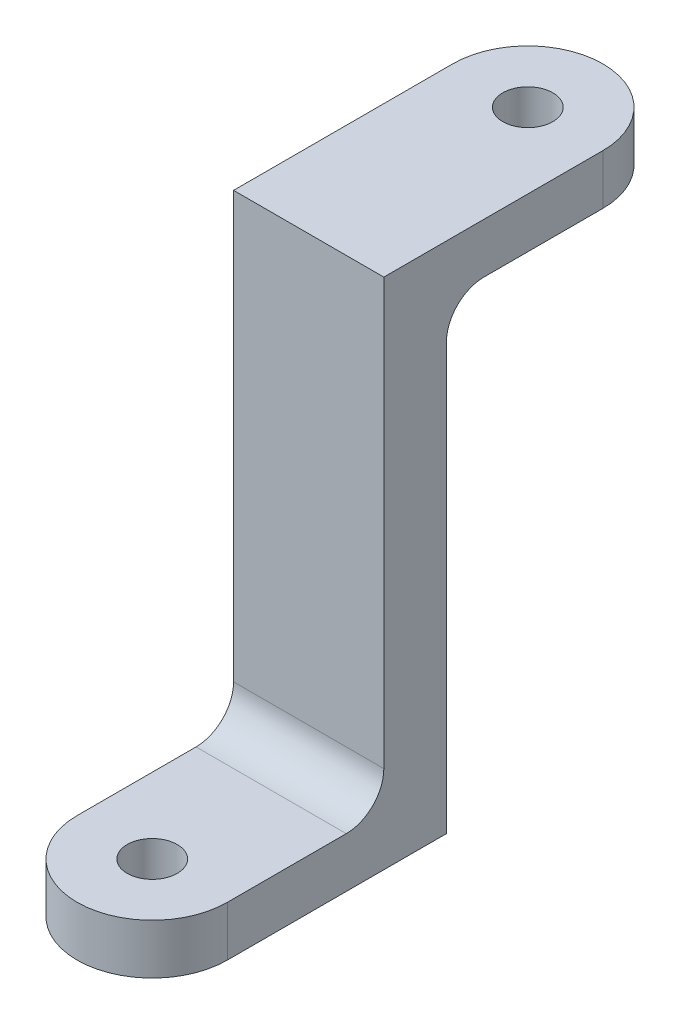
ISO-10303-21;
HEADER;
FILE_DESCRIPTION(('STEP AP214'),'2;1');
FILE_NAME('part.step','',(''),(''),'','','');
FILE_SCHEMA(('AUTOMOTIVE_DESIGN { 1 0 10303 214 1 1 1 1 }'));
ENDSEC;
DATA;
#1=APPLICATION_CONTEXT('core data for automotive mechanical design processes');
#2=APPLICATION_PROTOCOL_DEFINITION('international standard','automotive_design',2000,#1);
#3=PRODUCT_CONTEXT('',#1,'mechanical');
#4=PRODUCT('Part','Part','',(#3));
#5=PRODUCT_RELATED_PRODUCT_CATEGORY('part','',(#4));
#6=PRODUCT_DEFINITION_FORMATION('','',#4);
#7=PRODUCT_DEFINITION_CONTEXT('part definition',#1,'design');
#8=PRODUCT_DEFINITION('design','',#6,#7);
#9=PRODUCT_DEFINITION_SHAPE('','',#8);
#10=(LENGTH_UNIT() NAMED_UNIT(*) SI_UNIT(.MILLI.,.METRE.));
#11=(NAMED_UNIT(*) PLANE_ANGLE_UNIT() SI_UNIT($,.RADIAN.));
#12=(NAMED_UNIT(*) SI_UNIT($,.STERADIAN.) SOLID_ANGLE_UNIT());
#13=UNCERTAINTY_MEASURE_WITH_UNIT(LENGTH_MEASURE(1.E-05),#10,'distance_accuracy_value','');
#14=(GEOMETRIC_REPRESENTATION_CONTEXT(3) GLOBAL_UNCERTAINTY_ASSIGNED_CONTEXT((#13)) GLOBAL_UNIT_ASSIGNED_CONTEXT((#10,
#11,#12)) REPRESENTATION_CONTEXT('',''));
#15=CARTESIAN_POINT('',(0.,0.,0.));
#16=DIRECTION('',(0.,0.,1.));
#17=DIRECTION('',(1.,0.,0.));
#18=AXIS2_PLACEMENT_3D('',#15,#16,#17);
#19=CARTESIAN_POINT('',(6.,4.,0.));
#20=DIRECTION('',(1.,0.,0.));
#21=DIRECTION('',(0.,0.,-1.));
#22=AXIS2_PLACEMENT_3D('',#19,#20,#21);
#23=PLANE('',#22);
#24=DIRECTION('',(0.,0.,1.));
#25=VECTOR('',#24,1.);
#26=CARTESIAN_POINT('',(6.,0.,0.));
#27=LINE('',#26,#25);
#28=CARTESIAN_POINT('',(6.,0.,-17.5));
#29=VERTEX_POINT('',#28);
#30=CARTESIAN_POINT('',(6.,0.,0.));
#31=VERTEX_POINT('',#30);
#32=EDGE_CURVE('E134',#29,#31,#27,.T.);
#33=ORIENTED_EDGE('',*,*,#32,.F.);
#34=DIRECTION('',(0.,-1.,0.));
#35=VECTOR('',#34,1.);
#36=CARTESIAN_POINT('',(6.,37.,-17.5));
#37=LINE('',#36,#35);
#38=CARTESIAN_POINT('',(6.,34.,-17.5));
#39=VERTEX_POINT('',#38);
#40=EDGE_CURVE('E119',#39,#29,#37,.T.);
#41=ORIENTED_EDGE('',*,*,#40,.F.);
#42=CARTESIAN_POINT('',(6.,34.,-20.5));
#43=DIRECTION('',(1.,0.,0.));
#44=DIRECTION('',(0.,0.,-1.));
#45=AXIS2_PLACEMENT_3D('',#42,#43,#44);
#46=CIRCLE('',#45,3.);
#47=CARTESIAN_POINT('',(6.,37.,-20.5));
#48=VERTEX_POINT('',#47);
#49=EDGE_CURVE('E161',#39,#48,#46,.F.);
#50=ORIENTED_EDGE('',*,*,#49,.T.);
#51=DIRECTION('',(0.,0.,-1.));
#52=VECTOR('',#51,1.);
#53=CARTESIAN_POINT('',(6.,37.,0.));
#54=LINE('',#53,#52);
#55=CARTESIAN_POINT('',(6.,37.,-30.));
#56=VERTEX_POINT('',#55);
#57=EDGE_CURVE('E166',#48,#56,#54,.T.);
#58=ORIENTED_EDGE('',*,*,#57,.T.);
#59=DIRECTION('',(0.,-1.,0.));
#60=VECTOR('',#59,1.);
#61=CARTESIAN_POINT('',(6.,41.,-30.));
#62=LINE('',#61,#60);
#63=CARTESIAN_POINT('',(6.,41.,-30.));
#64=VERTEX_POINT('',#63);
#65=EDGE_CURVE('E240',#64,#56,#62,.T.);
#66=ORIENTED_EDGE('',*,*,#65,.F.);
#67=DIRECTION('',(0.,0.,-1.));
#68=VECTOR('',#67,1.);
#69=CARTESIAN_POINT('',(6.,41.,0.));
#70=LINE('',#69,#68);
#71=CARTESIAN_POINT('',(6.,41.,-12.5));
#72=VERTEX_POINT('',#71);
#73=EDGE_CURVE('E261',#72,#64,#70,.T.);
#74=ORIENTED_EDGE('',*,*,#73,.F.);
#75=DIRECTION('',(0.,-1.,0.));
#76=VECTOR('',#75,1.);
#77=CARTESIAN_POINT('',(6.,37.,-12.5));
#78=LINE('',#77,#76);
#79=CARTESIAN_POINT('',(6.,7.,-12.5));
#80=VERTEX_POINT('',#79);
#81=EDGE_CURVE('E138',#72,#80,#78,.T.);
#82=ORIENTED_EDGE('',*,*,#81,.T.);
#83=CARTESIAN_POINT('',(6.,7.,-9.5));
#84=DIRECTION('',(1.,0.,0.));
#85=DIRECTION('',(0.,0.,-1.));
#86=AXIS2_PLACEMENT_3D('',#83,#84,#85);
#87=CIRCLE('',#86,3.);
#88=CARTESIAN_POINT('',(6.,4.,-9.5));
#89=VERTEX_POINT('',#88);
#90=EDGE_CURVE('E11',#80,#89,#87,.F.);
#91=ORIENTED_EDGE('',*,*,#90,.T.);
#92=DIRECTION('',(0.,0.,1.));
#93=VECTOR('',#92,1.);
#94=CARTESIAN_POINT('',(6.,4.,0.));
#95=LINE('',#94,#93);
#96=CARTESIAN_POINT('',(6.,4.,0.));
#97=VERTEX_POINT('',#96);
#98=EDGE_CURVE('E144',#89,#97,#95,.T.);
#99=ORIENTED_EDGE('',*,*,#98,.T.);
#100=DIRECTION('',(0.,-1.,0.));
#101=VECTOR('',#100,1.);
#102=CARTESIAN_POINT('',(6.,4.,0.));
#103=LINE('',#102,#101);
#104=EDGE_CURVE('E145',#97,#31,#103,.T.);
#105=ORIENTED_EDGE('',*,*,#104,.T.);
#106=EDGE_LOOP('',(#33,#41,#50,#58,#66,#74,#82,#91,#99,#105));
#107=FACE_BOUND('',#106,.T.);
#108=ADVANCED_FACE('F35',(#107),#23,.T.);
#109=CARTESIAN_POINT('',(-6.,4.,0.));
#110=DIRECTION('',(1.,0.,0.));
#111=DIRECTION('',(0.,0.,-1.));
#112=AXIS2_PLACEMENT_3D('',#109,#110,#111);
#113=PLANE('',#112);
#114=DIRECTION('',(0.,-1.,0.));
#115=VECTOR('',#114,1.);
#116=CARTESIAN_POINT('',(-6.,37.,-17.5));
#117=LINE('',#116,#115);
#118=CARTESIAN_POINT('',(-6.,34.,-17.5));
#119=VERTEX_POINT('',#118);
#120=CARTESIAN_POINT('',(-6.,0.,-17.5));
#121=VERTEX_POINT('',#120);
#122=EDGE_CURVE('E108',#119,#121,#117,.T.);
#123=ORIENTED_EDGE('',*,*,#122,.T.);
#124=DIRECTION('',(0.,0.,1.));
#125=VECTOR('',#124,1.);
#126=CARTESIAN_POINT('',(-6.,0.,0.));
#127=LINE('',#126,#125);
#128=CARTESIAN_POINT('',(-6.,0.,0.));
#129=VERTEX_POINT('',#128);
#130=EDGE_CURVE('E113',#121,#129,#127,.T.);
#131=ORIENTED_EDGE('',*,*,#130,.T.);
#132=DIRECTION('',(0.,-1.,0.));
#133=VECTOR('',#132,1.);
#134=CARTESIAN_POINT('',(-6.,4.,0.));
#135=LINE('',#134,#133);
#136=CARTESIAN_POINT('',(-6.,4.,0.));
#137=VERTEX_POINT('',#136);
#138=EDGE_CURVE('E148',#137,#129,#135,.T.);
#139=ORIENTED_EDGE('',*,*,#138,.F.);
#140=DIRECTION('',(0.,0.,1.));
#141=VECTOR('',#140,1.);
#142=CARTESIAN_POINT('',(-6.,4.,0.));
#143=LINE('',#142,#141);
#144=CARTESIAN_POINT('',(-6.,4.,-9.5));
#145=VERTEX_POINT('',#144);
#146=EDGE_CURVE('E246',#145,#137,#143,.T.);
#147=ORIENTED_EDGE('',*,*,#146,.F.);
#148=CARTESIAN_POINT('',(-6.,7.,-9.5));
#149=DIRECTION('',(1.,0.,0.));
#150=DIRECTION('',(0.,0.,-1.));
#151=AXIS2_PLACEMENT_3D('',#148,#149,#150);
#152=CIRCLE('',#151,3.);
#153=CARTESIAN_POINT('',(-6.,7.,-12.5));
#154=VERTEX_POINT('',#153);
#155=EDGE_CURVE('E43',#145,#154,#152,.T.);
#156=ORIENTED_EDGE('',*,*,#155,.T.);
#157=DIRECTION('',(0.,-1.,0.));
#158=VECTOR('',#157,1.);
#159=CARTESIAN_POINT('',(-6.,37.,-12.5));
#160=LINE('',#159,#158);
#161=CARTESIAN_POINT('',(-6.,41.,-12.5));
#162=VERTEX_POINT('',#161);
#163=EDGE_CURVE('E120',#162,#154,#160,.T.);
#164=ORIENTED_EDGE('',*,*,#163,.F.);
#165=DIRECTION('',(0.,0.,1.));
#166=VECTOR('',#165,1.);
#167=CARTESIAN_POINT('',(-6.,41.,0.));
#168=LINE('',#167,#166);
#169=CARTESIAN_POINT('',(-6.,41.,-30.));
#170=VERTEX_POINT('',#169);
#171=EDGE_CURVE('E267',#170,#162,#168,.T.);
#172=ORIENTED_EDGE('',*,*,#171,.F.);
#173=DIRECTION('',(0.,-1.,0.));
#174=VECTOR('',#173,1.);
#175=CARTESIAN_POINT('',(-6.,41.,-30.));
#176=LINE('',#175,#174);
#177=CARTESIAN_POINT('',(-6.,37.,-30.));
#178=VERTEX_POINT('',#177);
#179=EDGE_CURVE('E237',#170,#178,#176,.T.);
#180=ORIENTED_EDGE('',*,*,#179,.T.);
#181=DIRECTION('',(0.,0.,1.));
#182=VECTOR('',#181,1.);
#183=CARTESIAN_POINT('',(-6.,37.,0.));
#184=LINE('',#183,#182);
#185=CARTESIAN_POINT('',(-6.,37.,-20.5));
#186=VERTEX_POINT('',#185);
#187=EDGE_CURVE('E234',#178,#186,#184,.T.);
#188=ORIENTED_EDGE('',*,*,#187,.T.);
#189=CARTESIAN_POINT('',(-6.,34.,-20.5));
#190=DIRECTION('',(1.,0.,0.));
#191=DIRECTION('',(0.,0.,-1.));
#192=AXIS2_PLACEMENT_3D('',#189,#190,#191);
#193=CIRCLE('',#192,3.);
#194=EDGE_CURVE('E116',#186,#119,#193,.T.);
#195=ORIENTED_EDGE('',*,*,#194,.T.);
#196=EDGE_LOOP('',(#123,#131,#139,#147,#156,#164,#172,#180,#188,#195));
#197=FACE_BOUND('',#196,.T.);
#198=ADVANCED_FACE('F110',(#197),#113,.F.);
#199=CARTESIAN_POINT('',(0.,0.,0.));
#200=DIRECTION('',(0.,1.,0.));
#201=DIRECTION('',(0.,0.,1.));
#202=AXIS2_PLACEMENT_3D('',#199,#200,#201);
#203=PLANE('',#202);
#204=CARTESIAN_POINT('',(0.,0.,0.));
#205=DIRECTION('',(0.,1.,0.));
#206=DIRECTION('',(0.,0.,1.));
#207=AXIS2_PLACEMENT_3D('',#204,#205,#206);
#208=CIRCLE('',#207,2.);
#209=CARTESIAN_POINT('',(0.,0.,2.));
#210=VERTEX_POINT('',#209);
#211=EDGE_CURVE('E136',#210,#210,#208,.T.);
#212=ORIENTED_EDGE('',*,*,#211,.T.);
#213=EDGE_LOOP('',(#212));
#214=FACE_BOUND('',#213,.T.);
#215=DIRECTION('',(-1.,0.,0.));
#216=VECTOR('',#215,1.);
#217=CARTESIAN_POINT('',(-6.,0.,-17.5));
#218=LINE('',#217,#216);
#219=EDGE_CURVE('E123',#29,#121,#218,.T.);
#220=ORIENTED_EDGE('',*,*,#219,.F.);
#221=ORIENTED_EDGE('',*,*,#32,.T.);
#222=CARTESIAN_POINT('',(0.,0.,0.));
#223=DIRECTION('',(0.,1.,0.));
#224=DIRECTION('',(0.,0.,1.));
#225=AXIS2_PLACEMENT_3D('',#222,#223,#224);
#226=CIRCLE('',#225,6.);
#227=EDGE_CURVE('E133',#129,#31,#226,.T.);
#228=ORIENTED_EDGE('',*,*,#227,.F.);
#229=ORIENTED_EDGE('',*,*,#130,.F.);
#230=EDGE_LOOP('',(#220,#221,#228,#229));
#231=FACE_BOUND('',#230,.T.);
#232=ADVANCED_FACE('F131',(#214,#231),#203,.F.);
#233=CARTESIAN_POINT('',(0.,4.,0.));
#234=DIRECTION('',(0.,1.,0.));
#235=DIRECTION('',(0.,0.,1.));
#236=AXIS2_PLACEMENT_3D('',#233,#234,#235);
#237=PLANE('',#236);
#238=CARTESIAN_POINT('',(0.,4.,0.));
#239=DIRECTION('',(0.,1.,0.));
#240=DIRECTION('',(0.,0.,1.));
#241=AXIS2_PLACEMENT_3D('',#238,#239,#240);
#242=CIRCLE('',#241,2.);
#243=CARTESIAN_POINT('',(0.,4.,2.));
#244=VERTEX_POINT('',#243);
#245=EDGE_CURVE('E149',#244,#244,#242,.T.);
#246=ORIENTED_EDGE('',*,*,#245,.F.);
#247=EDGE_LOOP('',(#246));
#248=FACE_BOUND('',#247,.T.);
#249=ORIENTED_EDGE('',*,*,#98,.F.);
#250=DIRECTION('',(-1.,0.,0.));
#251=VECTOR('',#250,1.);
#252=CARTESIAN_POINT('',(-6.,4.,-9.5));
#253=LINE('',#252,#251);
#254=EDGE_CURVE('E156',#89,#145,#253,.T.);
#255=ORIENTED_EDGE('',*,*,#254,.T.);
#256=ORIENTED_EDGE('',*,*,#146,.T.);
#257=CARTESIAN_POINT('',(0.,4.,0.));
#258=DIRECTION('',(0.,1.,0.));
#259=DIRECTION('',(0.,0.,1.));
#260=AXIS2_PLACEMENT_3D('',#257,#258,#259);
#261=CIRCLE('',#260,6.);
#262=EDGE_CURVE('E248',#137,#97,#261,.T.);
#263=ORIENTED_EDGE('',*,*,#262,.T.);
#264=EDGE_LOOP('',(#249,#255,#256,#263));
#265=FACE_BOUND('',#264,.T.);
#266=ADVANCED_FACE('F202',(#248,#265),#237,.T.);
#267=CARTESIAN_POINT('',(0.,4.,0.));
#268=DIRECTION('',(0.,-1.,0.));
#269=DIRECTION('',(0.,0.,-1.));
#270=AXIS2_PLACEMENT_3D('',#267,#268,#269);
#271=CYLINDRICAL_SURFACE('',#270,2.);
#272=ORIENTED_EDGE('',*,*,#245,.T.);
#273=EDGE_LOOP('',(#272));
#274=FACE_BOUND('',#273,.T.);
#275=ORIENTED_EDGE('',*,*,#211,.F.);
#276=EDGE_LOOP('',(#275));
#277=FACE_BOUND('',#276,.T.);
#278=ADVANCED_FACE('F198',(#274,#277),#271,.F.);
#279=CARTESIAN_POINT('',(0.,4.,0.));
#280=DIRECTION('',(0.,-1.,0.));
#281=DIRECTION('',(0.,0.,-1.));
#282=AXIS2_PLACEMENT_3D('',#279,#280,#281);
#283=CYLINDRICAL_SURFACE('',#282,6.);
#284=ORIENTED_EDGE('',*,*,#227,.T.);
#285=ORIENTED_EDGE('',*,*,#104,.F.);
#286=ORIENTED_EDGE('',*,*,#262,.F.);
#287=ORIENTED_EDGE('',*,*,#138,.T.);
#288=EDGE_LOOP('',(#284,#285,#286,#287));
#289=FACE_BOUND('',#288,.T.);
#290=ADVANCED_FACE('F194',(#289),#283,.T.);
#291=CARTESIAN_POINT('',(6.,37.,-12.5));
#292=DIRECTION('',(0.,0.,1.));
#293=DIRECTION('',(1.,0.,0.));
#294=AXIS2_PLACEMENT_3D('',#291,#292,#293);
#295=PLANE('',#294);
#296=ORIENTED_EDGE('',*,*,#163,.T.);
#297=DIRECTION('',(-1.,0.,0.));
#298=VECTOR('',#297,1.);
#299=CARTESIAN_POINT('',(6.,7.,-12.5));
#300=LINE('',#299,#298);
#301=EDGE_CURVE('E56',#154,#80,#300,.F.);
#302=ORIENTED_EDGE('',*,*,#301,.T.);
#303=ORIENTED_EDGE('',*,*,#81,.F.);
#304=DIRECTION('',(1.,0.,0.));
#305=VECTOR('',#304,1.);
#306=CARTESIAN_POINT('',(0.,41.,-12.5));
#307=LINE('',#306,#305);
#308=EDGE_CURVE('E230',#162,#72,#307,.T.);
#309=ORIENTED_EDGE('',*,*,#308,.F.);
#310=EDGE_LOOP('',(#296,#302,#303,#309));
#311=FACE_BOUND('',#310,.T.);
#312=ADVANCED_FACE('F197',(#311),#295,.T.);
#313=CARTESIAN_POINT('',(6.,37.,-17.5));
#314=DIRECTION('',(0.,0.,1.));
#315=DIRECTION('',(1.,0.,0.));
#316=AXIS2_PLACEMENT_3D('',#313,#314,#315);
#317=PLANE('',#316);
#318=ORIENTED_EDGE('',*,*,#40,.T.);
#319=ORIENTED_EDGE('',*,*,#219,.T.);
#320=ORIENTED_EDGE('',*,*,#122,.F.);
#321=DIRECTION('',(-1.,0.,0.));
#322=VECTOR('',#321,1.);
#323=CARTESIAN_POINT('',(6.,34.,-17.5));
#324=LINE('',#323,#322);
#325=EDGE_CURVE('E154',#119,#39,#324,.F.);
#326=ORIENTED_EDGE('',*,*,#325,.T.);
#327=EDGE_LOOP('',(#318,#319,#320,#326));
#328=FACE_BOUND('',#327,.T.);
#329=ADVANCED_FACE('F124',(#328),#317,.F.);
#330=CARTESIAN_POINT('',(0.,37.,0.));
#331=DIRECTION('',(0.,1.,0.));
#332=DIRECTION('',(0.,0.,1.));
#333=AXIS2_PLACEMENT_3D('',#330,#331,#332);
#334=PLANE('',#333);
#335=CARTESIAN_POINT('',(0.,37.,-30.));
#336=DIRECTION('',(0.,1.,0.));
#337=DIRECTION('',(0.,0.,1.));
#338=AXIS2_PLACEMENT_3D('',#335,#336,#337);
#339=CIRCLE('',#338,2.);
#340=CARTESIAN_POINT('',(0.,37.,-28.));
#341=VERTEX_POINT('',#340);
#342=EDGE_CURVE('E128',#341,#341,#339,.T.);
#343=ORIENTED_EDGE('',*,*,#342,.T.);
#344=EDGE_LOOP('',(#343));
#345=FACE_BOUND('',#344,.T.);
#346=ORIENTED_EDGE('',*,*,#57,.F.);
#347=DIRECTION('',(-1.,0.,0.));
#348=VECTOR('',#347,1.);
#349=CARTESIAN_POINT('',(-6.,37.,-20.5));
#350=LINE('',#349,#348);
#351=EDGE_CURVE('E151',#48,#186,#350,.T.);
#352=ORIENTED_EDGE('',*,*,#351,.T.);
#353=ORIENTED_EDGE('',*,*,#187,.F.);
#354=CARTESIAN_POINT('',(0.,37.,-30.));
#355=DIRECTION('',(0.,1.,0.));
#356=DIRECTION('',(0.,0.,1.));
#357=AXIS2_PLACEMENT_3D('',#354,#355,#356);
#358=CIRCLE('',#357,6.);
#359=EDGE_CURVE('E173',#56,#178,#358,.T.);
#360=ORIENTED_EDGE('',*,*,#359,.F.);
#361=EDGE_LOOP('',(#346,#352,#353,#360));
#362=FACE_BOUND('',#361,.T.);
#363=ADVANCED_FACE('F171',(#345,#362),#334,.F.);
#364=CARTESIAN_POINT('',(0.,41.,-30.));
#365=DIRECTION('',(0.,-1.,0.));
#366=DIRECTION('',(0.,0.,-1.));
#367=AXIS2_PLACEMENT_3D('',#364,#365,#366);
#368=CYLINDRICAL_SURFACE('',#367,6.);
#369=ORIENTED_EDGE('',*,*,#359,.T.);
#370=ORIENTED_EDGE('',*,*,#179,.F.);
#371=CARTESIAN_POINT('',(0.,41.,-30.));
#372=DIRECTION('',(0.,1.,0.));
#373=DIRECTION('',(0.,0.,1.));
#374=AXIS2_PLACEMENT_3D('',#371,#372,#373);
#375=CIRCLE('',#374,6.);
#376=EDGE_CURVE('E268',#64,#170,#375,.T.);
#377=ORIENTED_EDGE('',*,*,#376,.F.);
#378=ORIENTED_EDGE('',*,*,#65,.T.);
#379=EDGE_LOOP('',(#369,#370,#377,#378));
#380=FACE_BOUND('',#379,.T.);
#381=ADVANCED_FACE('F216',(#380),#368,.T.);
#382=CARTESIAN_POINT('',(0.,41.,-30.));
#383=DIRECTION('',(0.,-1.,0.));
#384=DIRECTION('',(0.,0.,-1.));
#385=AXIS2_PLACEMENT_3D('',#382,#383,#384);
#386=CYLINDRICAL_SURFACE('',#385,2.);
#387=CARTESIAN_POINT('',(0.,41.,-30.));
#388=DIRECTION('',(0.,1.,0.));
#389=DIRECTION('',(0.,0.,1.));
#390=AXIS2_PLACEMENT_3D('',#387,#388,#389);
#391=CIRCLE('',#390,2.);
#392=CARTESIAN_POINT('',(0.,41.,-28.));
#393=VERTEX_POINT('',#392);
#394=EDGE_CURVE('E236',#393,#393,#391,.T.);
#395=ORIENTED_EDGE('',*,*,#394,.T.);
#396=EDGE_LOOP('',(#395));
#397=FACE_BOUND('',#396,.T.);
#398=ORIENTED_EDGE('',*,*,#342,.F.);
#399=EDGE_LOOP('',(#398));
#400=FACE_BOUND('',#399,.T.);
#401=ADVANCED_FACE('F184',(#397,#400),#386,.F.);
#402=CARTESIAN_POINT('',(0.,41.,0.));
#403=DIRECTION('',(0.,1.,0.));
#404=DIRECTION('',(0.,0.,1.));
#405=AXIS2_PLACEMENT_3D('',#402,#403,#404);
#406=PLANE('',#405);
#407=ORIENTED_EDGE('',*,*,#394,.F.);
#408=EDGE_LOOP('',(#407));
#409=FACE_BOUND('',#408,.T.);
#410=ORIENTED_EDGE('',*,*,#73,.T.);
#411=ORIENTED_EDGE('',*,*,#376,.T.);
#412=ORIENTED_EDGE('',*,*,#171,.T.);
#413=ORIENTED_EDGE('',*,*,#308,.T.);
#414=EDGE_LOOP('',(#410,#411,#412,#413));
#415=FACE_BOUND('',#414,.T.);
#416=ADVANCED_FACE('F178',(#409,#415),#406,.T.);
#417=CARTESIAN_POINT('',(0.,34.,-20.5));
#418=DIRECTION('',(1.,0.,0.));
#419=DIRECTION('',(0.,0.,-1.));
#420=AXIS2_PLACEMENT_3D('',#417,#418,#419);
#421=CYLINDRICAL_SURFACE('',#420,3.);
#422=ORIENTED_EDGE('',*,*,#49,.F.);
#423=ORIENTED_EDGE('',*,*,#325,.F.);
#424=ORIENTED_EDGE('',*,*,#194,.F.);
#425=ORIENTED_EDGE('',*,*,#351,.F.);
#426=EDGE_LOOP('',(#422,#423,#424,#425));
#427=FACE_BOUND('',#426,.T.);
#428=ADVANCED_FACE('F176',(#427),#421,.F.);
#429=CARTESIAN_POINT('',(0.,7.,-9.5));
#430=DIRECTION('',(1.,0.,0.));
#431=DIRECTION('',(0.,0.,-1.));
#432=AXIS2_PLACEMENT_3D('',#429,#430,#431);
#433=CYLINDRICAL_SURFACE('',#432,3.);
#434=ORIENTED_EDGE('',*,*,#90,.F.);
#435=ORIENTED_EDGE('',*,*,#301,.F.);
#436=ORIENTED_EDGE('',*,*,#155,.F.);
#437=ORIENTED_EDGE('',*,*,#254,.F.);
#438=EDGE_LOOP('',(#434,#435,#436,#437));
#439=FACE_BOUND('',#438,.T.);
#440=ADVANCED_FACE('F37',(#439),#433,.F.);
#441=CLOSED_SHELL('',(#108,#198,#232,#266,#278,#290,#312,#329,#363,#381,#401,#416,#428,#440));
#442=MANIFOLD_SOLID_BREP('B2',#441);
#443=ADVANCED_BREP_SHAPE_REPRESENTATION('',(#18,#442),#14);
#444=SHAPE_DEFINITION_REPRESENTATION(#9,#443);
ENDSEC;
END-ISO-10303-21;
